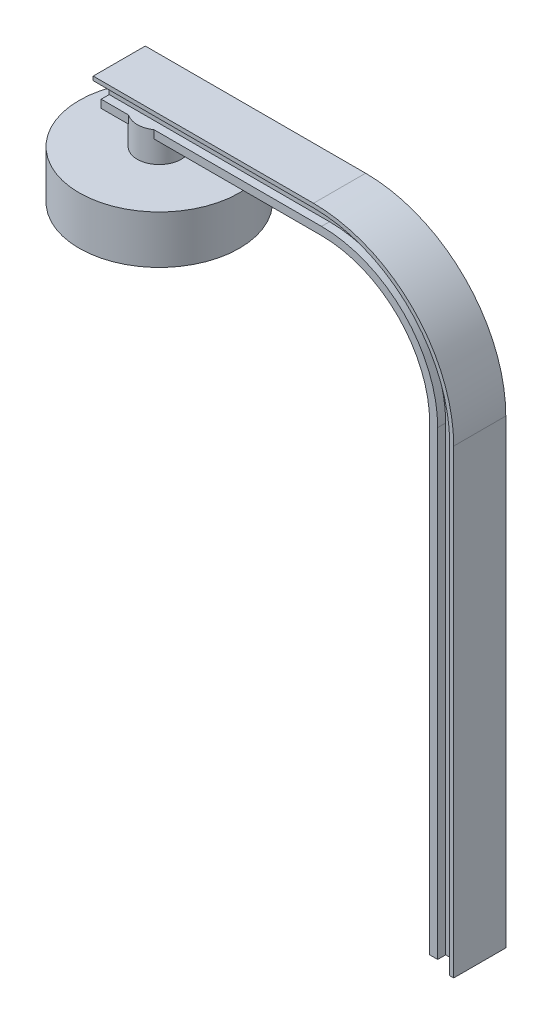
ISO-10303-21;
HEADER;
FILE_DESCRIPTION(('STEP AP214'),'2;1');
FILE_NAME('part.step','',(''),(''),'','','');
FILE_SCHEMA(('AUTOMOTIVE_DESIGN { 1 0 10303 214 1 1 1 1 }'));
ENDSEC;
DATA;
#1=APPLICATION_CONTEXT('core data for automotive mechanical design processes');
#2=APPLICATION_PROTOCOL_DEFINITION('international standard','automotive_design',2000,#1);
#3=PRODUCT_CONTEXT('',#1,'mechanical');
#4=PRODUCT('Part','Part','',(#3));
#5=PRODUCT_RELATED_PRODUCT_CATEGORY('part','',(#4));
#6=PRODUCT_DEFINITION_FORMATION('','',#4);
#7=PRODUCT_DEFINITION_CONTEXT('part definition',#1,'design');
#8=PRODUCT_DEFINITION('design','',#6,#7);
#9=PRODUCT_DEFINITION_SHAPE('','',#8);
#10=(LENGTH_UNIT() NAMED_UNIT(*) SI_UNIT(.MILLI.,.METRE.));
#11=(NAMED_UNIT(*) PLANE_ANGLE_UNIT() SI_UNIT($,.RADIAN.));
#12=(NAMED_UNIT(*) SI_UNIT($,.STERADIAN.) SOLID_ANGLE_UNIT());
#13=UNCERTAINTY_MEASURE_WITH_UNIT(LENGTH_MEASURE(1.E-05),#10,'distance_accuracy_value','');
#14=(GEOMETRIC_REPRESENTATION_CONTEXT(3) GLOBAL_UNCERTAINTY_ASSIGNED_CONTEXT((#13)) GLOBAL_UNIT_ASSIGNED_CONTEXT((#10,
#11,#12)) REPRESENTATION_CONTEXT('',''));
#15=CARTESIAN_POINT('',(0.,0.,0.));
#16=DIRECTION('',(0.,0.,1.));
#17=DIRECTION('',(1.,0.,0.));
#18=AXIS2_PLACEMENT_3D('',#15,#16,#17);
#19=CARTESIAN_POINT('',(-35.,142.,-4.5));
#20=DIRECTION('',(0.,0.913811548620255,0.406138466053453));
#21=DIRECTION('',(0.,-0.406138466053453,0.913811548620255));
#22=AXIS2_PLACEMENT_3D('',#19,#20,#21);
#23=PLANE('',#22);
#24=DIRECTION('',(-1.,0.,0.));
#25=VECTOR('',#24,1.);
#26=CARTESIAN_POINT('',(-35.,142.,-4.5));
#27=LINE('',#26,#25);
#28=CARTESIAN_POINT('',(-83.1622776601684,142.,-4.5));
#29=VERTEX_POINT('',#28);
#30=CARTESIAN_POINT('',(-90.,142.,-4.5));
#31=VERTEX_POINT('',#30);
#32=EDGE_CURVE('E360',#29,#31,#27,.T.);
#33=ORIENTED_EDGE('',*,*,#32,.F.);
#34=CARTESIAN_POINT('',(-80.,140.,0.));
#35=DIRECTION('',(0.,0.913811548620255,0.406138466053453));
#36=DIRECTION('',(0.,0.406138466053453,-0.913811548620255));
#37=AXIS2_PLACEMENT_3D('',#34,#35,#36);
#38=ELLIPSE('',#37,6.01874643443097,5.5);
#39=CARTESIAN_POINT('',(-85.5,140.,0.));
#40=VERTEX_POINT('',#39);
#41=EDGE_CURVE('E541',#29,#40,#38,.T.);
#42=ORIENTED_EDGE('',*,*,#41,.T.);
#43=DIRECTION('',(-1.,0.,0.));
#44=VECTOR('',#43,1.);
#45=CARTESIAN_POINT('',(-35.,140.,0.));
#46=LINE('',#45,#44);
#47=CARTESIAN_POINT('',(-90.,140.,0.));
#48=VERTEX_POINT('',#47);
#49=EDGE_CURVE('E355',#40,#48,#46,.T.);
#50=ORIENTED_EDGE('',*,*,#49,.T.);
#51=DIRECTION('',(0.,0.406138466053453,-0.913811548620255));
#52=VECTOR('',#51,1.);
#53=CARTESIAN_POINT('',(-90.,142.,-4.5));
#54=LINE('',#53,#52);
#55=EDGE_CURVE('E350',#48,#31,#54,.T.);
#56=ORIENTED_EDGE('',*,*,#55,.T.);
#57=EDGE_LOOP('',(#33,#42,#50,#56));
#58=FACE_BOUND('',#57,.T.);
#59=ADVANCED_FACE('F36',(#58),#23,.F.);
#60=CARTESIAN_POINT('',(-35.,144.,-4.5));
#61=DIRECTION('',(0.,0.,1.));
#62=DIRECTION('',(1.,0.,0.));
#63=AXIS2_PLACEMENT_3D('',#60,#61,#62);
#64=PLANE('',#63);
#65=CARTESIAN_POINT('',(-35.,142.,-4.5));
#66=VERTEX_POINT('',#65);
#67=CARTESIAN_POINT('',(-76.8377223398316,142.,-4.5));
#68=VERTEX_POINT('',#67);
#69=EDGE_CURVE('E363',#66,#68,#27,.T.);
#70=ORIENTED_EDGE('',*,*,#69,.T.);
#71=DIRECTION('',(0.,1.,0.));
#72=VECTOR('',#71,1.);
#73=CARTESIAN_POINT('',(-76.8377223398316,136.5,-4.5));
#74=LINE('',#73,#72);
#75=CARTESIAN_POINT('',(-76.8377223398316,144.,-4.5));
#76=VERTEX_POINT('',#75);
#77=EDGE_CURVE('E546',#68,#76,#74,.T.);
#78=ORIENTED_EDGE('',*,*,#77,.T.);
#79=DIRECTION('',(-1.,0.,0.));
#80=VECTOR('',#79,1.);
#81=CARTESIAN_POINT('',(-35.,144.,-4.5));
#82=LINE('',#81,#80);
#83=CARTESIAN_POINT('',(-35.,144.,-4.5));
#84=VERTEX_POINT('',#83);
#85=EDGE_CURVE('E367',#84,#76,#82,.T.);
#86=ORIENTED_EDGE('',*,*,#85,.F.);
#87=CARTESIAN_POINT('',(-35.0000010733833,114.999998926617,-4.5));
#88=DIRECTION('',(0.,0.,-1.));
#89=DIRECTION('',(3.70132158338394E-08,0.999999999999999,0.));
#90=AXIS2_PLACEMENT_3D('',#87,#88,#89);
#91=CIRCLE('',#90,29.0000010733833);
#92=CARTESIAN_POINT('',(-5.99999999999994,114.999998742608,-4.5));
#93=VERTEX_POINT('',#92);
#94=EDGE_CURVE('E331',#84,#93,#91,.T.);
#95=ORIENTED_EDGE('',*,*,#94,.T.);
#96=DIRECTION('',(0.,1.,0.));
#97=VECTOR('',#96,1.);
#98=CARTESIAN_POINT('',(-5.99999999999996,-1.15000017327474,-4.5));
#99=LINE('',#98,#97);
#100=CARTESIAN_POINT('',(-5.99999999999996,0.,-4.5));
#101=VERTEX_POINT('',#100);
#102=EDGE_CURVE('E302',#101,#93,#99,.T.);
#103=ORIENTED_EDGE('',*,*,#102,.F.);
#104=DIRECTION('',(1.,0.,0.));
#105=VECTOR('',#104,1.);
#106=CARTESIAN_POINT('',(-7.99999999999996,0.,-4.5));
#107=LINE('',#106,#105);
#108=CARTESIAN_POINT('',(-7.99999999999996,0.,-4.5));
#109=VERTEX_POINT('',#108);
#110=EDGE_CURVE('E303',#109,#101,#107,.T.);
#111=ORIENTED_EDGE('',*,*,#110,.F.);
#112=DIRECTION('',(0.,1.,0.));
#113=VECTOR('',#112,1.);
#114=CARTESIAN_POINT('',(-7.99999999999996,-1.15000023461093,-4.5));
#115=LINE('',#114,#113);
#116=CARTESIAN_POINT('',(-7.99999999999994,114.999998681272,-4.5));
#117=VERTEX_POINT('',#116);
#118=EDGE_CURVE('E301',#109,#117,#115,.T.);
#119=ORIENTED_EDGE('',*,*,#118,.T.);
#120=CARTESIAN_POINT('',(-35.0000010733833,114.999998926617,-4.5));
#121=DIRECTION('',(0.,0.,-1.));
#122=DIRECTION('',(3.97549354162381E-08,0.999999999999999,0.));
#123=AXIS2_PLACEMENT_3D('',#120,#121,#122);
#124=CIRCLE('',#123,27.0000010733833);
#125=EDGE_CURVE('E328',#66,#117,#124,.T.);
#126=ORIENTED_EDGE('',*,*,#125,.F.);
#127=EDGE_LOOP('',(#70,#78,#86,#95,#103,#111,#119,#126));
#128=FACE_BOUND('',#127,.T.);
#129=ADVANCED_FACE('F565',(#128),#64,.F.);
#130=CARTESIAN_POINT('',(-35.,144.,4.5));
#131=DIRECTION('',(0.,0.,-1.));
#132=DIRECTION('',(-1.,0.,0.));
#133=AXIS2_PLACEMENT_3D('',#130,#131,#132);
#134=PLANE('',#133);
#135=DIRECTION('',(-1.,0.,0.));
#136=VECTOR('',#135,1.);
#137=CARTESIAN_POINT('',(-35.,142.,4.5));
#138=LINE('',#137,#136);
#139=CARTESIAN_POINT('',(-83.1622776601684,142.,4.5));
#140=VERTEX_POINT('',#139);
#141=CARTESIAN_POINT('',(-90.,142.,4.5));
#142=VERTEX_POINT('',#141);
#143=EDGE_CURVE('E265',#140,#142,#138,.T.);
#144=ORIENTED_EDGE('',*,*,#143,.F.);
#145=DIRECTION('',(0.,1.,0.));
#146=VECTOR('',#145,1.);
#147=CARTESIAN_POINT('',(-83.1622776601684,136.5,4.5));
#148=LINE('',#147,#146);
#149=CARTESIAN_POINT('',(-83.1622776601684,144.,4.5));
#150=VERTEX_POINT('',#149);
#151=EDGE_CURVE('E51',#140,#150,#148,.T.);
#152=ORIENTED_EDGE('',*,*,#151,.T.);
#153=DIRECTION('',(-1.,0.,0.));
#154=VECTOR('',#153,1.);
#155=CARTESIAN_POINT('',(-35.,144.,4.5));
#156=LINE('',#155,#154);
#157=CARTESIAN_POINT('',(-90.,144.,4.5));
#158=VERTEX_POINT('',#157);
#159=EDGE_CURVE('E257',#150,#158,#156,.T.);
#160=ORIENTED_EDGE('',*,*,#159,.T.);
#161=DIRECTION('',(0.,-1.,0.));
#162=VECTOR('',#161,1.);
#163=CARTESIAN_POINT('',(-90.,144.,4.5));
#164=LINE('',#163,#162);
#165=EDGE_CURVE('E423',#158,#142,#164,.T.);
#166=ORIENTED_EDGE('',*,*,#165,.T.);
#167=EDGE_LOOP('',(#144,#152,#160,#166));
#168=FACE_BOUND('',#167,.T.);
#169=ADVANCED_FACE('F421',(#168),#134,.F.);
#170=CARTESIAN_POINT('',(-35.,142.,4.5));
#171=DIRECTION('',(0.,0.913811548620255,-0.406138466053453));
#172=DIRECTION('',(0.,0.406138466053453,0.913811548620255));
#173=AXIS2_PLACEMENT_3D('',#170,#171,#172);
#174=PLANE('',#173);
#175=CARTESIAN_POINT('',(-35.,142.,4.5));
#176=VERTEX_POINT('',#175);
#177=CARTESIAN_POINT('',(-76.8377223398316,142.,4.5));
#178=VERTEX_POINT('',#177);
#179=EDGE_CURVE('E267',#176,#178,#138,.T.);
#180=ORIENTED_EDGE('',*,*,#179,.T.);
#181=CARTESIAN_POINT('',(-80.,140.,0.));
#182=DIRECTION('',(0.,0.913811548620255,-0.406138466053453));
#183=DIRECTION('',(0.,0.406138466053453,0.913811548620255));
#184=AXIS2_PLACEMENT_3D('',#181,#182,#183);
#185=ELLIPSE('',#184,6.01874643443097,5.5);
#186=CARTESIAN_POINT('',(-74.5,140.,0.));
#187=VERTEX_POINT('',#186);
#188=EDGE_CURVE('E11',#178,#187,#185,.T.);
#189=ORIENTED_EDGE('',*,*,#188,.T.);
#190=CARTESIAN_POINT('',(-35.,140.,0.));
#191=VERTEX_POINT('',#190);
#192=EDGE_CURVE('E357',#191,#187,#46,.T.);
#193=ORIENTED_EDGE('',*,*,#192,.F.);
#194=DIRECTION('',(0.,0.406138466053453,0.913811548620255));
#195=VECTOR('',#194,1.);
#196=CARTESIAN_POINT('',(-35.,142.,4.5));
#197=LINE('',#196,#195);
#198=EDGE_CURVE('E275',#176,#191,#197,.F.);
#199=ORIENTED_EDGE('',*,*,#198,.F.);
#200=EDGE_LOOP('',(#180,#189,#193,#199));
#201=FACE_BOUND('',#200,.T.);
#202=ADVANCED_FACE('F653',(#201),#174,.F.);
#203=CARTESIAN_POINT('',(-35.0000010733833,114.999998926617,6.5));
#204=DIRECTION('',(0.,0.,-1.));
#205=DIRECTION('',(-1.,0.,0.));
#206=AXIS2_PLACEMENT_3D('',#203,#204,#205);
#207=PLANE('',#206);
#208=CARTESIAN_POINT('',(-35.0000010733833,114.999998926617,6.5));
#209=DIRECTION('',(0.,0.,-1.));
#210=DIRECTION('',(3.15700960301147E-08,1.,0.));
#211=AXIS2_PLACEMENT_3D('',#208,#209,#210);
#212=CIRCLE('',#211,34.0000010733833);
#213=CARTESIAN_POINT('',(-35.,149.,6.5));
#214=VERTEX_POINT('',#213);
#215=CARTESIAN_POINT('',(-0.999999999999966,114.999998895949,6.5));
#216=VERTEX_POINT('',#215);
#217=EDGE_CURVE('E497',#214,#216,#212,.T.);
#218=ORIENTED_EDGE('',*,*,#217,.T.);
#219=DIRECTION('',(0.,1.,0.));
#220=VECTOR('',#219,1.);
#221=CARTESIAN_POINT('',(-0.99999999999998,-1.15000001993427,6.5));
#222=LINE('',#221,#220);
#223=CARTESIAN_POINT('',(-0.99999999999998,0.,6.5));
#224=VERTEX_POINT('',#223);
#225=EDGE_CURVE('E491',#224,#216,#222,.T.);
#226=ORIENTED_EDGE('',*,*,#225,.F.);
#227=DIRECTION('',(-1.,0.,0.));
#228=VECTOR('',#227,1.);
#229=CARTESIAN_POINT('',(0.,0.,6.5));
#230=LINE('',#229,#228);
#231=CARTESIAN_POINT('',(0.,0.,6.5));
#232=VERTEX_POINT('',#231);
#233=EDGE_CURVE('E388',#232,#224,#230,.T.);
#234=ORIENTED_EDGE('',*,*,#233,.F.);
#235=DIRECTION('',(0.,1.,0.));
#236=VECTOR('',#235,1.);
#237=CARTESIAN_POINT('',(0.,0.,6.5));
#238=LINE('',#237,#236);
#239=CARTESIAN_POINT('',(0.,114.999998926617,6.5));
#240=VERTEX_POINT('',#239);
#241=EDGE_CURVE('E377',#232,#240,#238,.T.);
#242=ORIENTED_EDGE('',*,*,#241,.T.);
#243=CARTESIAN_POINT('',(-35.0000010733833,114.999998926617,6.5));
#244=DIRECTION('',(0.,0.,-1.));
#245=DIRECTION('',(-1.,0.,0.));
#246=AXIS2_PLACEMENT_3D('',#243,#244,#245);
#247=CIRCLE('',#246,35.0000010733833);
#248=CARTESIAN_POINT('',(-35.,150.,6.5));
#249=VERTEX_POINT('',#248);
#250=EDGE_CURVE('E379',#249,#240,#247,.T.);
#251=ORIENTED_EDGE('',*,*,#250,.F.);
#252=DIRECTION('',(-1.,0.,0.));
#253=VECTOR('',#252,1.);
#254=CARTESIAN_POINT('',(-35.,150.,6.5));
#255=LINE('',#254,#253);
#256=CARTESIAN_POINT('',(-90.,150.,6.5));
#257=VERTEX_POINT('',#256);
#258=EDGE_CURVE('E383',#249,#257,#255,.T.);
#259=ORIENTED_EDGE('',*,*,#258,.T.);
#260=DIRECTION('',(0.,-1.,0.));
#261=VECTOR('',#260,1.);
#262=CARTESIAN_POINT('',(-90.,150.,6.5));
#263=LINE('',#262,#261);
#264=CARTESIAN_POINT('',(-90.,149.,6.5));
#265=VERTEX_POINT('',#264);
#266=EDGE_CURVE('E385',#257,#265,#263,.T.);
#267=ORIENTED_EDGE('',*,*,#266,.T.);
#268=DIRECTION('',(-1.,0.,0.));
#269=VECTOR('',#268,1.);
#270=CARTESIAN_POINT('',(-35.,149.,6.5));
#271=LINE('',#270,#269);
#272=EDGE_CURVE('E274',#214,#265,#271,.T.);
#273=ORIENTED_EDGE('',*,*,#272,.F.);
#274=EDGE_LOOP('',(#218,#226,#234,#242,#251,#259,#267,#273));
#275=FACE_BOUND('',#274,.T.);
#276=ADVANCED_FACE('F510',(#275),#207,.F.);
#277=CARTESIAN_POINT('',(-35.0000010733833,114.999998926617,-6.5));
#278=DIRECTION('',(0.,0.,-1.));
#279=DIRECTION('',(-1.,0.,0.));
#280=AXIS2_PLACEMENT_3D('',#277,#278,#279);
#281=PLANE('',#280);
#282=DIRECTION('',(0.,1.,0.));
#283=VECTOR('',#282,1.);
#284=CARTESIAN_POINT('',(-0.99999999999998,-1.15000001993427,-6.5));
#285=LINE('',#284,#283);
#286=CARTESIAN_POINT('',(-0.999999999999966,0.,-6.5));
#287=VERTEX_POINT('',#286);
#288=CARTESIAN_POINT('',(-0.999999999999966,114.999998895949,-6.5));
#289=VERTEX_POINT('',#288);
#290=EDGE_CURVE('E293',#287,#289,#285,.T.);
#291=ORIENTED_EDGE('',*,*,#290,.T.);
#292=CARTESIAN_POINT('',(-35.0000010733833,114.999998926617,-6.5));
#293=DIRECTION('',(0.,0.,-1.));
#294=DIRECTION('',(3.15700960301147E-08,1.,0.));
#295=AXIS2_PLACEMENT_3D('',#292,#293,#294);
#296=CIRCLE('',#295,34.0000010733833);
#297=CARTESIAN_POINT('',(-35.,149.,-6.5));
#298=VERTEX_POINT('',#297);
#299=EDGE_CURVE('E317',#298,#289,#296,.T.);
#300=ORIENTED_EDGE('',*,*,#299,.F.);
#301=DIRECTION('',(-1.,0.,0.));
#302=VECTOR('',#301,1.);
#303=CARTESIAN_POINT('',(-35.,149.,-6.5));
#304=LINE('',#303,#302);
#305=CARTESIAN_POINT('',(-90.,149.,-6.5));
#306=VERTEX_POINT('',#305);
#307=EDGE_CURVE('E353',#298,#306,#304,.T.);
#308=ORIENTED_EDGE('',*,*,#307,.T.);
#309=DIRECTION('',(0.,-1.,0.));
#310=VECTOR('',#309,1.);
#311=CARTESIAN_POINT('',(-90.,150.,-6.5));
#312=LINE('',#311,#310);
#313=CARTESIAN_POINT('',(-90.,150.,-6.5));
#314=VERTEX_POINT('',#313);
#315=EDGE_CURVE('E399',#314,#306,#312,.T.);
#316=ORIENTED_EDGE('',*,*,#315,.F.);
#317=DIRECTION('',(-1.,0.,0.));
#318=VECTOR('',#317,1.);
#319=CARTESIAN_POINT('',(-35.,150.,-6.5));
#320=LINE('',#319,#318);
#321=CARTESIAN_POINT('',(-35.,150.,-6.5));
#322=VERTEX_POINT('',#321);
#323=EDGE_CURVE('E397',#322,#314,#320,.T.);
#324=ORIENTED_EDGE('',*,*,#323,.F.);
#325=CARTESIAN_POINT('',(-35.0000010733833,114.999998926617,-6.5));
#326=DIRECTION('',(0.,0.,-1.));
#327=DIRECTION('',(-1.,0.,0.));
#328=AXIS2_PLACEMENT_3D('',#325,#326,#327);
#329=CIRCLE('',#328,35.0000010733833);
#330=CARTESIAN_POINT('',(0.,114.999998926617,-6.5));
#331=VERTEX_POINT('',#330);
#332=EDGE_CURVE('E394',#322,#331,#329,.T.);
#333=ORIENTED_EDGE('',*,*,#332,.T.);
#334=DIRECTION('',(0.,1.,0.));
#335=VECTOR('',#334,1.);
#336=CARTESIAN_POINT('',(0.,0.,-6.5));
#337=LINE('',#336,#335);
#338=CARTESIAN_POINT('',(0.,0.,-6.5));
#339=VERTEX_POINT('',#338);
#340=EDGE_CURVE('E376',#339,#331,#337,.T.);
#341=ORIENTED_EDGE('',*,*,#340,.F.);
#342=DIRECTION('',(-1.,0.,0.));
#343=VECTOR('',#342,1.);
#344=CARTESIAN_POINT('',(0.,0.,-6.5));
#345=LINE('',#344,#343);
#346=EDGE_CURVE('E380',#339,#287,#345,.T.);
#347=ORIENTED_EDGE('',*,*,#346,.T.);
#348=EDGE_LOOP('',(#291,#300,#308,#316,#324,#333,#341,#347));
#349=FACE_BOUND('',#348,.T.);
#350=ADVANCED_FACE('F518',(#349),#281,.T.);
#351=CARTESIAN_POINT('',(0.,0.,6.5));
#352=DIRECTION('',(-1.,0.,0.));
#353=DIRECTION('',(0.,-1.,0.));
#354=AXIS2_PLACEMENT_3D('',#351,#352,#353);
#355=PLANE('',#354);
#356=ORIENTED_EDGE('',*,*,#340,.T.);
#357=DIRECTION('',(0.,0.,-1.));
#358=VECTOR('',#357,1.);
#359=CARTESIAN_POINT('',(0.,114.999998926617,6.5));
#360=LINE('',#359,#358);
#361=EDGE_CURVE('E409',#240,#331,#360,.T.);
#362=ORIENTED_EDGE('',*,*,#361,.F.);
#363=ORIENTED_EDGE('',*,*,#241,.F.);
#364=DIRECTION('',(0.,0.,-1.));
#365=VECTOR('',#364,1.);
#366=CARTESIAN_POINT('',(0.,0.,6.5));
#367=LINE('',#366,#365);
#368=EDGE_CURVE('E391',#232,#339,#367,.T.);
#369=ORIENTED_EDGE('',*,*,#368,.T.);
#370=EDGE_LOOP('',(#356,#362,#363,#369));
#371=FACE_BOUND('',#370,.T.);
#372=ADVANCED_FACE('F38',(#371),#355,.F.);
#373=CARTESIAN_POINT('',(-35.0000010733833,114.999998926617,6.5));
#374=DIRECTION('',(0.,0.,-1.));
#375=DIRECTION('',(-1.,0.,0.));
#376=AXIS2_PLACEMENT_3D('',#373,#374,#375);
#377=CYLINDRICAL_SURFACE('',#376,35.0000010733833);
#378=ORIENTED_EDGE('',*,*,#332,.F.);
#379=DIRECTION('',(0.,0.,-1.));
#380=VECTOR('',#379,1.);
#381=CARTESIAN_POINT('',(-35.,150.,6.5));
#382=LINE('',#381,#380);
#383=EDGE_CURVE('E408',#249,#322,#382,.T.);
#384=ORIENTED_EDGE('',*,*,#383,.F.);
#385=ORIENTED_EDGE('',*,*,#250,.T.);
#386=ORIENTED_EDGE('',*,*,#361,.T.);
#387=EDGE_LOOP('',(#378,#384,#385,#386));
#388=FACE_BOUND('',#387,.T.);
#389=ADVANCED_FACE('F924',(#388),#377,.T.);
#390=CARTESIAN_POINT('',(-35.,150.,6.5));
#391=DIRECTION('',(0.,-1.,0.));
#392=DIRECTION('',(0.,0.,-1.));
#393=AXIS2_PLACEMENT_3D('',#390,#391,#392);
#394=PLANE('',#393);
#395=ORIENTED_EDGE('',*,*,#323,.T.);
#396=DIRECTION('',(0.,0.,-1.));
#397=VECTOR('',#396,1.);
#398=CARTESIAN_POINT('',(-90.,150.,6.5));
#399=LINE('',#398,#397);
#400=EDGE_CURVE('E405',#257,#314,#399,.T.);
#401=ORIENTED_EDGE('',*,*,#400,.F.);
#402=ORIENTED_EDGE('',*,*,#258,.F.);
#403=ORIENTED_EDGE('',*,*,#383,.T.);
#404=EDGE_LOOP('',(#395,#401,#402,#403));
#405=FACE_BOUND('',#404,.T.);
#406=ADVANCED_FACE('F845',(#405),#394,.F.);
#407=CARTESIAN_POINT('',(-90.,150.,6.5));
#408=DIRECTION('',(1.,0.,0.));
#409=DIRECTION('',(0.,0.,-1.));
#410=AXIS2_PLACEMENT_3D('',#407,#408,#409);
#411=PLANE('',#410);
#412=ORIENTED_EDGE('',*,*,#55,.F.);
#413=DIRECTION('',(0.,-0.406138466053453,-0.913811548620255));
#414=VECTOR('',#413,1.);
#415=CARTESIAN_POINT('',(-90.,142.,4.5));
#416=LINE('',#415,#414);
#417=EDGE_CURVE('E279',#142,#48,#416,.T.);
#418=ORIENTED_EDGE('',*,*,#417,.F.);
#419=ORIENTED_EDGE('',*,*,#165,.F.);
#420=DIRECTION('',(0.,0.,1.));
#421=VECTOR('',#420,1.);
#422=CARTESIAN_POINT('',(-90.,144.,2.5));
#423=LINE('',#422,#421);
#424=CARTESIAN_POINT('',(-90.,144.,2.5));
#425=VERTEX_POINT('',#424);
#426=EDGE_CURVE('E427',#425,#158,#423,.T.);
#427=ORIENTED_EDGE('',*,*,#426,.F.);
#428=DIRECTION('',(0.,-1.,0.));
#429=VECTOR('',#428,1.);
#430=CARTESIAN_POINT('',(-90.,149.,2.5));
#431=LINE('',#430,#429);
#432=CARTESIAN_POINT('',(-90.,149.,2.5));
#433=VERTEX_POINT('',#432);
#434=EDGE_CURVE('E285',#433,#425,#431,.T.);
#435=ORIENTED_EDGE('',*,*,#434,.F.);
#436=DIRECTION('',(0.,0.,-1.));
#437=VECTOR('',#436,1.);
#438=CARTESIAN_POINT('',(-90.,149.,6.5));
#439=LINE('',#438,#437);
#440=EDGE_CURVE('E282',#265,#433,#439,.T.);
#441=ORIENTED_EDGE('',*,*,#440,.F.);
#442=ORIENTED_EDGE('',*,*,#266,.F.);
#443=ORIENTED_EDGE('',*,*,#400,.T.);
#444=ORIENTED_EDGE('',*,*,#315,.T.);
#445=DIRECTION('',(0.,0.,-1.));
#446=VECTOR('',#445,1.);
#447=CARTESIAN_POINT('',(-90.,149.,-6.5));
#448=LINE('',#447,#446);
#449=CARTESIAN_POINT('',(-90.,149.,-2.5));
#450=VERTEX_POINT('',#449);
#451=EDGE_CURVE('E59',#450,#306,#448,.T.);
#452=ORIENTED_EDGE('',*,*,#451,.F.);
#453=DIRECTION('',(0.,1.,0.));
#454=VECTOR('',#453,1.);
#455=CARTESIAN_POINT('',(-90.,149.,-2.5));
#456=LINE('',#455,#454);
#457=CARTESIAN_POINT('',(-90.,144.,-2.5));
#458=VERTEX_POINT('',#457);
#459=EDGE_CURVE('E341',#458,#450,#456,.T.);
#460=ORIENTED_EDGE('',*,*,#459,.F.);
#461=DIRECTION('',(0.,0.,1.));
#462=VECTOR('',#461,1.);
#463=CARTESIAN_POINT('',(-90.,144.,-2.5));
#464=LINE('',#463,#462);
#465=CARTESIAN_POINT('',(-90.,144.,-4.5));
#466=VERTEX_POINT('',#465);
#467=EDGE_CURVE('E343',#466,#458,#464,.T.);
#468=ORIENTED_EDGE('',*,*,#467,.F.);
#469=DIRECTION('',(0.,1.,0.));
#470=VECTOR('',#469,1.);
#471=CARTESIAN_POINT('',(-90.,144.,-4.5));
#472=LINE('',#471,#470);
#473=EDGE_CURVE('E347',#31,#466,#472,.T.);
#474=ORIENTED_EDGE('',*,*,#473,.F.);
#475=EDGE_LOOP('',(#412,#418,#419,#427,#435,#441,#442,#443,#444,#452,#460,#468,#474));
#476=FACE_BOUND('',#475,.T.);
#477=ADVANCED_FACE('F430',(#476),#411,.F.);
#478=CARTESIAN_POINT('',(0.,0.,6.5));
#479=DIRECTION('',(0.,-1.,0.));
#480=DIRECTION('',(0.,0.,-1.));
#481=AXIS2_PLACEMENT_3D('',#478,#479,#480);
#482=PLANE('',#481);
#483=DIRECTION('',(0.,0.,-1.));
#484=VECTOR('',#483,1.);
#485=CARTESIAN_POINT('',(-0.99999999999998,0.,6.5));
#486=LINE('',#485,#484);
#487=CARTESIAN_POINT('',(-0.999999999999938,0.,2.5));
#488=VERTEX_POINT('',#487);
#489=EDGE_CURVE('E480',#224,#488,#486,.T.);
#490=ORIENTED_EDGE('',*,*,#489,.T.);
#491=DIRECTION('',(-1.,0.,0.));
#492=VECTOR('',#491,1.);
#493=CARTESIAN_POINT('',(-0.999999999999952,0.,2.5));
#494=LINE('',#493,#492);
#495=CARTESIAN_POINT('',(-5.99999999999996,0.,2.5));
#496=VERTEX_POINT('',#495);
#497=EDGE_CURVE('E481',#488,#496,#494,.T.);
#498=ORIENTED_EDGE('',*,*,#497,.T.);
#499=DIRECTION('',(0.,0.,1.));
#500=VECTOR('',#499,1.);
#501=CARTESIAN_POINT('',(-5.99999999999996,0.,2.5));
#502=LINE('',#501,#500);
#503=CARTESIAN_POINT('',(-5.99999999999994,0.,4.5));
#504=VERTEX_POINT('',#503);
#505=EDGE_CURVE('E479',#496,#504,#502,.T.);
#506=ORIENTED_EDGE('',*,*,#505,.T.);
#507=DIRECTION('',(-1.,0.,0.));
#508=VECTOR('',#507,1.);
#509=CARTESIAN_POINT('',(-5.99999999999996,0.,4.5));
#510=LINE('',#509,#508);
#511=CARTESIAN_POINT('',(-7.99999999999996,0.,4.5));
#512=VERTEX_POINT('',#511);
#513=EDGE_CURVE('E496',#504,#512,#510,.T.);
#514=ORIENTED_EDGE('',*,*,#513,.T.);
#515=DIRECTION('',(-0.406138466053452,0.,-0.913811548620255));
#516=VECTOR('',#515,1.);
#517=CARTESIAN_POINT('',(-7.99999999999996,0.,4.5));
#518=LINE('',#517,#516);
#519=CARTESIAN_POINT('',(-9.99999999999998,0.,0.));
#520=VERTEX_POINT('',#519);
#521=EDGE_CURVE('E493',#512,#520,#518,.T.);
#522=ORIENTED_EDGE('',*,*,#521,.T.);
#523=DIRECTION('',(0.406138466053452,0.,-0.913811548620255));
#524=VECTOR('',#523,1.);
#525=CARTESIAN_POINT('',(-9.99999999999998,0.,0.));
#526=LINE('',#525,#524);
#527=EDGE_CURVE('E298',#520,#109,#526,.T.);
#528=ORIENTED_EDGE('',*,*,#527,.T.);
#529=ORIENTED_EDGE('',*,*,#110,.T.);
#530=DIRECTION('',(0.,0.,1.));
#531=VECTOR('',#530,1.);
#532=CARTESIAN_POINT('',(-5.99999999999996,0.,-4.5));
#533=LINE('',#532,#531);
#534=CARTESIAN_POINT('',(-5.99999999999996,0.,-2.5));
#535=VERTEX_POINT('',#534);
#536=EDGE_CURVE('E284',#101,#535,#533,.T.);
#537=ORIENTED_EDGE('',*,*,#536,.T.);
#538=DIRECTION('',(1.,0.,0.));
#539=VECTOR('',#538,1.);
#540=CARTESIAN_POINT('',(-5.99999999999996,0.,-2.5));
#541=LINE('',#540,#539);
#542=CARTESIAN_POINT('',(-0.999999999999952,0.,-2.5));
#543=VERTEX_POINT('',#542);
#544=EDGE_CURVE('E289',#535,#543,#541,.T.);
#545=ORIENTED_EDGE('',*,*,#544,.T.);
#546=DIRECTION('',(0.,0.,-1.));
#547=VECTOR('',#546,1.);
#548=CARTESIAN_POINT('',(-0.999999999999952,0.,-2.5));
#549=LINE('',#548,#547);
#550=EDGE_CURVE('E294',#543,#287,#549,.T.);
#551=ORIENTED_EDGE('',*,*,#550,.T.);
#552=ORIENTED_EDGE('',*,*,#346,.F.);
#553=ORIENTED_EDGE('',*,*,#368,.F.);
#554=ORIENTED_EDGE('',*,*,#233,.T.);
#555=EDGE_LOOP('',(#490,#498,#506,#514,#522,#528,#529,#537,#545,#551,#552,#553,#554));
#556=FACE_BOUND('',#555,.T.);
#557=ADVANCED_FACE('F558',(#556),#482,.T.);
#558=ORIENTED_EDGE('',*,*,#192,.T.);
#559=EDGE_CURVE('E247',#187,#68,#38,.T.);
#560=ORIENTED_EDGE('',*,*,#559,.T.);
#561=ORIENTED_EDGE('',*,*,#69,.F.);
#562=DIRECTION('',(0.,0.406138466053453,-0.913811548620255));
#563=VECTOR('',#562,1.);
#564=CARTESIAN_POINT('',(-35.,142.,-4.5));
#565=LINE('',#564,#563);
#566=EDGE_CURVE('E340',#191,#66,#565,.T.);
#567=ORIENTED_EDGE('',*,*,#566,.F.);
#568=EDGE_LOOP('',(#558,#560,#561,#567));
#569=FACE_BOUND('',#568,.T.);
#570=ADVANCED_FACE('F590',(#569),#23,.F.);
#571=CARTESIAN_POINT('',(-83.1622776601684,144.,-4.5));
#572=VERTEX_POINT('',#571);
#573=EDGE_CURVE('E366',#572,#466,#82,.T.);
#574=ORIENTED_EDGE('',*,*,#573,.F.);
#575=DIRECTION('',(0.,1.,0.));
#576=VECTOR('',#575,1.);
#577=CARTESIAN_POINT('',(-83.1622776601684,136.5,-4.5));
#578=LINE('',#577,#576);
#579=EDGE_CURVE('E248',#572,#29,#578,.F.);
#580=ORIENTED_EDGE('',*,*,#579,.T.);
#581=ORIENTED_EDGE('',*,*,#32,.T.);
#582=ORIENTED_EDGE('',*,*,#473,.T.);
#583=EDGE_LOOP('',(#574,#580,#581,#582));
#584=FACE_BOUND('',#583,.T.);
#585=ADVANCED_FACE('F538',(#584),#64,.F.);
#586=CARTESIAN_POINT('',(-35.,144.,-2.5));
#587=DIRECTION('',(0.,-1.,0.));
#588=DIRECTION('',(0.,0.,-1.));
#589=AXIS2_PLACEMENT_3D('',#586,#587,#588);
#590=PLANE('',#589);
#591=ORIENTED_EDGE('',*,*,#467,.T.);
#592=DIRECTION('',(-1.,0.,0.));
#593=VECTOR('',#592,1.);
#594=CARTESIAN_POINT('',(-35.,144.,-2.5));
#595=LINE('',#594,#593);
#596=CARTESIAN_POINT('',(-35.,144.,-2.5));
#597=VERTEX_POINT('',#596);
#598=EDGE_CURVE('E370',#597,#458,#595,.T.);
#599=ORIENTED_EDGE('',*,*,#598,.F.);
#600=DIRECTION('',(0.,0.,1.));
#601=VECTOR('',#600,1.);
#602=CARTESIAN_POINT('',(-35.,144.,-2.5));
#603=LINE('',#602,#601);
#604=EDGE_CURVE('E362',#84,#597,#603,.T.);
#605=ORIENTED_EDGE('',*,*,#604,.F.);
#606=ORIENTED_EDGE('',*,*,#85,.T.);
#607=CARTESIAN_POINT('',(-80.,144.,0.));
#608=DIRECTION('',(0.,1.,0.));
#609=DIRECTION('',(0.,0.,1.));
#610=AXIS2_PLACEMENT_3D('',#607,#608,#609);
#611=CIRCLE('',#610,5.5);
#612=EDGE_CURVE('E258',#76,#572,#611,.T.);
#613=ORIENTED_EDGE('',*,*,#612,.T.);
#614=ORIENTED_EDGE('',*,*,#573,.T.);
#615=EDGE_LOOP('',(#591,#599,#605,#606,#613,#614));
#616=FACE_BOUND('',#615,.T.);
#617=ADVANCED_FACE('F532',(#616),#590,.F.);
#618=CARTESIAN_POINT('',(-35.,149.,-2.5));
#619=DIRECTION('',(0.,0.,1.));
#620=DIRECTION('',(1.,0.,0.));
#621=AXIS2_PLACEMENT_3D('',#618,#619,#620);
#622=PLANE('',#621);
#623=ORIENTED_EDGE('',*,*,#459,.T.);
#624=DIRECTION('',(-1.,0.,0.));
#625=VECTOR('',#624,1.);
#626=CARTESIAN_POINT('',(-35.,149.,-2.5));
#627=LINE('',#626,#625);
#628=CARTESIAN_POINT('',(-35.,149.,-2.5));
#629=VERTEX_POINT('',#628);
#630=EDGE_CURVE('E344',#629,#450,#627,.T.);
#631=ORIENTED_EDGE('',*,*,#630,.F.);
#632=CARTESIAN_POINT('',(-35.0000010733833,114.999998926617,-2.5));
#633=DIRECTION('',(0.,0.,-1.));
#634=DIRECTION('',(3.15700960301146E-08,1.,0.));
#635=AXIS2_PLACEMENT_3D('',#632,#633,#634);
#636=CIRCLE('',#635,34.0000010733833);
#637=CARTESIAN_POINT('',(-0.999999999999938,114.999998895949,-2.5));
#638=VERTEX_POINT('',#637);
#639=EDGE_CURVE('E313',#629,#638,#636,.T.);
#640=ORIENTED_EDGE('',*,*,#639,.T.);
#641=DIRECTION('',(0.,1.,0.));
#642=VECTOR('',#641,1.);
#643=CARTESIAN_POINT('',(-0.999999999999952,-1.15000001993427,-2.5));
#644=LINE('',#643,#642);
#645=EDGE_CURVE('E292',#543,#638,#644,.T.);
#646=ORIENTED_EDGE('',*,*,#645,.F.);
#647=ORIENTED_EDGE('',*,*,#544,.F.);
#648=DIRECTION('',(0.,1.,0.));
#649=VECTOR('',#648,1.);
#650=CARTESIAN_POINT('',(-5.99999999999996,-1.15000017327474,-2.5));
#651=LINE('',#650,#649);
#652=CARTESIAN_POINT('',(-5.99999999999994,114.999998742608,-2.5));
#653=VERTEX_POINT('',#652);
#654=EDGE_CURVE('E288',#535,#653,#651,.T.);
#655=ORIENTED_EDGE('',*,*,#654,.T.);
#656=CARTESIAN_POINT('',(-35.0000010733833,114.999998926617,-2.5));
#657=DIRECTION('',(0.,0.,-1.));
#658=DIRECTION('',(3.70132158338394E-08,0.999999999999999,0.));
#659=AXIS2_PLACEMENT_3D('',#656,#657,#658);
#660=CIRCLE('',#659,29.0000010733833);
#661=EDGE_CURVE('E337',#597,#653,#660,.T.);
#662=ORIENTED_EDGE('',*,*,#661,.F.);
#663=ORIENTED_EDGE('',*,*,#598,.T.);
#664=EDGE_LOOP('',(#623,#631,#640,#646,#647,#655,#662,#663));
#665=FACE_BOUND('',#664,.T.);
#666=ADVANCED_FACE('F525',(#665),#622,.F.);
#667=CARTESIAN_POINT('',(-35.,149.,-6.5));
#668=DIRECTION('',(0.,1.,0.));
#669=DIRECTION('',(0.,0.,1.));
#670=AXIS2_PLACEMENT_3D('',#667,#668,#669);
#671=PLANE('',#670);
#672=ORIENTED_EDGE('',*,*,#451,.T.);
#673=ORIENTED_EDGE('',*,*,#307,.F.);
#674=DIRECTION('',(0.,0.,-1.));
#675=VECTOR('',#674,1.);
#676=CARTESIAN_POINT('',(-35.,149.,-6.5));
#677=LINE('',#676,#675);
#678=EDGE_CURVE('E356',#629,#298,#677,.T.);
#679=ORIENTED_EDGE('',*,*,#678,.F.);
#680=ORIENTED_EDGE('',*,*,#630,.T.);
#681=EDGE_LOOP('',(#672,#673,#679,#680));
#682=FACE_BOUND('',#681,.T.);
#683=ADVANCED_FACE('F521',(#682),#671,.F.);
#684=CARTESIAN_POINT('',(-35.0000010733833,114.999998926617,-6.5));
#685=DIRECTION('',(0.,0.,-1.));
#686=DIRECTION('',(-1.,0.,0.));
#687=AXIS2_PLACEMENT_3D('',#684,#685,#686);
#688=CYLINDRICAL_SURFACE('',#687,34.0000010733833);
#689=ORIENTED_EDGE('',*,*,#299,.T.);
#690=DIRECTION('',(0.,0.,-1.));
#691=VECTOR('',#690,1.);
#692=CARTESIAN_POINT('',(-0.999999999999945,114.999998895949,-2.5));
#693=LINE('',#692,#691);
#694=EDGE_CURVE('E315',#638,#289,#693,.T.);
#695=ORIENTED_EDGE('',*,*,#694,.F.);
#696=ORIENTED_EDGE('',*,*,#639,.F.);
#697=ORIENTED_EDGE('',*,*,#678,.T.);
#698=EDGE_LOOP('',(#689,#695,#696,#697));
#699=FACE_BOUND('',#698,.T.);
#700=ADVANCED_FACE('F574',(#699),#688,.F.);
#701=CARTESIAN_POINT('',(-35.0000010733833,114.999998926617,0.));
#702=DIRECTION('',(0.,0.,-1.));
#703=DIRECTION('',(-1.,0.,0.));
#704=AXIS2_PLACEMENT_3D('',#701,#702,#703);
#705=CONICAL_SURFACE('',#704,25.0000010733833,0.418224329579234);
#706=ORIENTED_EDGE('',*,*,#125,.T.);
#707=DIRECTION('',(0.406138466053452,1.24554922143192E-08,-0.913811548620255));
#708=VECTOR('',#707,1.);
#709=CARTESIAN_POINT('',(-9.99999999999998,114.999998619936,0.));
#710=LINE('',#709,#708);
#711=CARTESIAN_POINT('',(-9.99999999999997,114.999998619936,0.));
#712=VERTEX_POINT('',#711);
#713=EDGE_CURVE('E325',#712,#117,#710,.T.);
#714=ORIENTED_EDGE('',*,*,#713,.F.);
#715=CARTESIAN_POINT('',(-35.0000010733833,114.999998926617,0.));
#716=DIRECTION('',(0.,0.,-1.));
#717=DIRECTION('',(4.29353301129858E-08,0.999999999999999,0.));
#718=AXIS2_PLACEMENT_3D('',#715,#716,#717);
#719=CIRCLE('',#718,25.0000010733833);
#720=EDGE_CURVE('E320',#191,#712,#719,.T.);
#721=ORIENTED_EDGE('',*,*,#720,.F.);
#722=ORIENTED_EDGE('',*,*,#566,.T.);
#723=EDGE_LOOP('',(#706,#714,#721,#722));
#724=FACE_BOUND('',#723,.T.);
#725=ADVANCED_FACE('F576',(#724),#705,.F.);
#726=CARTESIAN_POINT('',(-35.0000010733833,114.999998926617,-6.5));
#727=DIRECTION('',(0.,0.,-1.));
#728=DIRECTION('',(-1.,0.,0.));
#729=AXIS2_PLACEMENT_3D('',#726,#727,#728);
#730=CYLINDRICAL_SURFACE('',#729,29.0000010733833);
#731=ORIENTED_EDGE('',*,*,#661,.T.);
#732=DIRECTION('',(0.,0.,1.));
#733=VECTOR('',#732,1.);
#734=CARTESIAN_POINT('',(-5.99999999999995,114.999998742608,-4.5));
#735=LINE('',#734,#733);
#736=EDGE_CURVE('E334',#93,#653,#735,.T.);
#737=ORIENTED_EDGE('',*,*,#736,.F.);
#738=ORIENTED_EDGE('',*,*,#94,.F.);
#739=ORIENTED_EDGE('',*,*,#604,.T.);
#740=EDGE_LOOP('',(#731,#737,#738,#739));
#741=FACE_BOUND('',#740,.T.);
#742=ADVANCED_FACE('F582',(#741),#730,.T.);
#743=CARTESIAN_POINT('',(-5.99999999999996,-1.15000017327474,-4.5));
#744=DIRECTION('',(-1.,0.,0.));
#745=DIRECTION('',(0.,-1.,0.));
#746=AXIS2_PLACEMENT_3D('',#743,#744,#745);
#747=PLANE('',#746);
#748=ORIENTED_EDGE('',*,*,#102,.T.);
#749=ORIENTED_EDGE('',*,*,#736,.T.);
#750=ORIENTED_EDGE('',*,*,#654,.F.);
#751=ORIENTED_EDGE('',*,*,#536,.F.);
#752=EDGE_LOOP('',(#748,#749,#750,#751));
#753=FACE_BOUND('',#752,.T.);
#754=ADVANCED_FACE('F569',(#753),#747,.F.);
#755=CARTESIAN_POINT('',(-9.99999999999998,-1.15000029594711,0.));
#756=DIRECTION('',(0.913811548620255,0.,0.406138466053452));
#757=DIRECTION('',(0.406138466053452,0.,-0.913811548620255));
#758=AXIS2_PLACEMENT_3D('',#755,#756,#757);
#759=PLANE('',#758);
#760=DIRECTION('',(0.,1.,0.));
#761=VECTOR('',#760,1.);
#762=CARTESIAN_POINT('',(-9.99999999999998,-1.15000029594711,0.));
#763=LINE('',#762,#761);
#764=EDGE_CURVE('E297',#520,#712,#763,.T.);
#765=ORIENTED_EDGE('',*,*,#764,.T.);
#766=ORIENTED_EDGE('',*,*,#713,.T.);
#767=ORIENTED_EDGE('',*,*,#118,.F.);
#768=ORIENTED_EDGE('',*,*,#527,.F.);
#769=EDGE_LOOP('',(#765,#766,#767,#768));
#770=FACE_BOUND('',#769,.T.);
#771=ADVANCED_FACE('F562',(#770),#759,.F.);
#772=CARTESIAN_POINT('',(-0.999999999999952,-1.15000001993427,-2.5));
#773=DIRECTION('',(1.,0.,0.));
#774=DIRECTION('',(0.,0.,-1.));
#775=AXIS2_PLACEMENT_3D('',#772,#773,#774);
#776=PLANE('',#775);
#777=ORIENTED_EDGE('',*,*,#645,.T.);
#778=ORIENTED_EDGE('',*,*,#694,.T.);
#779=ORIENTED_EDGE('',*,*,#290,.F.);
#780=ORIENTED_EDGE('',*,*,#550,.F.);
#781=EDGE_LOOP('',(#777,#778,#779,#780));
#782=FACE_BOUND('',#781,.T.);
#783=ADVANCED_FACE('F573',(#782),#776,.F.);
#784=CARTESIAN_POINT('',(-35.,149.,2.5));
#785=DIRECTION('',(0.,0.,-1.));
#786=DIRECTION('',(-1.,0.,0.));
#787=AXIS2_PLACEMENT_3D('',#784,#785,#786);
#788=PLANE('',#787);
#789=ORIENTED_EDGE('',*,*,#434,.T.);
#790=DIRECTION('',(-1.,0.,0.));
#791=VECTOR('',#790,1.);
#792=CARTESIAN_POINT('',(-35.,144.,2.5));
#793=LINE('',#792,#791);
#794=CARTESIAN_POINT('',(-35.,144.,2.5));
#795=VERTEX_POINT('',#794);
#796=EDGE_CURVE('E269',#795,#425,#793,.T.);
#797=ORIENTED_EDGE('',*,*,#796,.F.);
#798=CARTESIAN_POINT('',(-35.0000010733833,114.999998926617,2.5));
#799=DIRECTION('',(0.,0.,-1.));
#800=DIRECTION('',(3.70132158338394E-08,0.999999999999999,0.));
#801=AXIS2_PLACEMENT_3D('',#798,#799,#800);
#802=CIRCLE('',#801,29.0000010733833);
#803=CARTESIAN_POINT('',(-5.99999999999994,114.999998742608,2.5));
#804=VERTEX_POINT('',#803);
#805=EDGE_CURVE('E455',#795,#804,#802,.T.);
#806=ORIENTED_EDGE('',*,*,#805,.T.);
#807=DIRECTION('',(0.,1.,0.));
#808=VECTOR('',#807,1.);
#809=CARTESIAN_POINT('',(-5.99999999999996,-1.15000017327474,2.5));
#810=LINE('',#809,#808);
#811=EDGE_CURVE('E456',#496,#804,#810,.T.);
#812=ORIENTED_EDGE('',*,*,#811,.F.);
#813=ORIENTED_EDGE('',*,*,#497,.F.);
#814=DIRECTION('',(0.,1.,0.));
#815=VECTOR('',#814,1.);
#816=CARTESIAN_POINT('',(-0.999999999999952,-1.15000001993427,2.5));
#817=LINE('',#816,#815);
#818=CARTESIAN_POINT('',(-0.999999999999938,114.999998895949,2.5));
#819=VERTEX_POINT('',#818);
#820=EDGE_CURVE('E484',#488,#819,#817,.T.);
#821=ORIENTED_EDGE('',*,*,#820,.T.);
#822=CARTESIAN_POINT('',(-35.0000010733833,114.999998926617,2.5));
#823=DIRECTION('',(0.,0.,-1.));
#824=DIRECTION('',(3.15700960301146E-08,1.,0.));
#825=AXIS2_PLACEMENT_3D('',#822,#823,#824);
#826=CIRCLE('',#825,34.0000010733833);
#827=CARTESIAN_POINT('',(-35.,149.,2.5));
#828=VERTEX_POINT('',#827);
#829=EDGE_CURVE('E448',#828,#819,#826,.T.);
#830=ORIENTED_EDGE('',*,*,#829,.F.);
#831=DIRECTION('',(-1.,0.,0.));
#832=VECTOR('',#831,1.);
#833=CARTESIAN_POINT('',(-35.,149.,2.5));
#834=LINE('',#833,#832);
#835=EDGE_CURVE('E281',#828,#433,#834,.T.);
#836=ORIENTED_EDGE('',*,*,#835,.T.);
#837=EDGE_LOOP('',(#789,#797,#806,#812,#813,#821,#830,#836));
#838=FACE_BOUND('',#837,.T.);
#839=ADVANCED_FACE('F445',(#838),#788,.F.);
#840=CARTESIAN_POINT('',(-35.,144.,2.5));
#841=DIRECTION('',(0.,-1.,0.));
#842=DIRECTION('',(0.,0.,-1.));
#843=AXIS2_PLACEMENT_3D('',#840,#841,#842);
#844=PLANE('',#843);
#845=ORIENTED_EDGE('',*,*,#159,.F.);
#846=CARTESIAN_POINT('',(-76.8377223398316,144.,4.5));
#847=VERTEX_POINT('',#846);
#848=EDGE_CURVE('E242',#150,#847,#611,.T.);
#849=ORIENTED_EDGE('',*,*,#848,.T.);
#850=CARTESIAN_POINT('',(-35.,144.,4.5));
#851=VERTEX_POINT('',#850);
#852=EDGE_CURVE('E255',#851,#847,#156,.T.);
#853=ORIENTED_EDGE('',*,*,#852,.F.);
#854=DIRECTION('',(0.,0.,-1.));
#855=VECTOR('',#854,1.);
#856=CARTESIAN_POINT('',(-35.,144.,2.5));
#857=LINE('',#856,#855);
#858=EDGE_CURVE('E271',#795,#851,#857,.F.);
#859=ORIENTED_EDGE('',*,*,#858,.F.);
#860=ORIENTED_EDGE('',*,*,#796,.T.);
#861=ORIENTED_EDGE('',*,*,#426,.T.);
#862=EDGE_LOOP('',(#845,#849,#853,#859,#860,#861));
#863=FACE_BOUND('',#862,.T.);
#864=ADVANCED_FACE('F253',(#863),#844,.F.);
#865=ORIENTED_EDGE('',*,*,#852,.T.);
#866=DIRECTION('',(0.,1.,0.));
#867=VECTOR('',#866,1.);
#868=CARTESIAN_POINT('',(-76.8377223398316,136.5,4.5));
#869=LINE('',#868,#867);
#870=EDGE_CURVE('E239',#847,#178,#869,.F.);
#871=ORIENTED_EDGE('',*,*,#870,.T.);
#872=ORIENTED_EDGE('',*,*,#179,.F.);
#873=CARTESIAN_POINT('',(-35.0000010733833,114.999998926617,4.5));
#874=DIRECTION('',(0.,0.,-1.));
#875=DIRECTION('',(3.97549354162381E-08,0.999999999999999,0.));
#876=AXIS2_PLACEMENT_3D('',#873,#874,#875);
#877=CIRCLE('',#876,27.0000010733833);
#878=CARTESIAN_POINT('',(-7.99999999999994,114.999998681272,4.5));
#879=VERTEX_POINT('',#878);
#880=EDGE_CURVE('E468',#176,#879,#877,.T.);
#881=ORIENTED_EDGE('',*,*,#880,.T.);
#882=DIRECTION('',(0.,1.,0.));
#883=VECTOR('',#882,1.);
#884=CARTESIAN_POINT('',(-7.99999999999996,-1.15000023461093,4.5));
#885=LINE('',#884,#883);
#886=EDGE_CURVE('E494',#512,#879,#885,.T.);
#887=ORIENTED_EDGE('',*,*,#886,.F.);
#888=ORIENTED_EDGE('',*,*,#513,.F.);
#889=DIRECTION('',(0.,1.,0.));
#890=VECTOR('',#889,1.);
#891=CARTESIAN_POINT('',(-5.99999999999996,-1.15000017327474,4.5));
#892=LINE('',#891,#890);
#893=CARTESIAN_POINT('',(-5.99999999999994,114.999998742608,4.5));
#894=VERTEX_POINT('',#893);
#895=EDGE_CURVE('E477',#504,#894,#892,.T.);
#896=ORIENTED_EDGE('',*,*,#895,.T.);
#897=CARTESIAN_POINT('',(-35.0000010733833,114.999998926617,4.5));
#898=DIRECTION('',(0.,0.,-1.));
#899=DIRECTION('',(3.70132158338394E-08,0.999999999999999,0.));
#900=AXIS2_PLACEMENT_3D('',#897,#898,#899);
#901=CIRCLE('',#900,29.0000010733833);
#902=EDGE_CURVE('E264',#851,#894,#901,.T.);
#903=ORIENTED_EDGE('',*,*,#902,.F.);
#904=EDGE_LOOP('',(#865,#871,#872,#881,#887,#888,#896,#903));
#905=FACE_BOUND('',#904,.T.);
#906=ADVANCED_FACE('F262',(#905),#134,.F.);
#907=ORIENTED_EDGE('',*,*,#49,.F.);
#908=EDGE_CURVE('E40',#40,#140,#185,.T.);
#909=ORIENTED_EDGE('',*,*,#908,.T.);
#910=ORIENTED_EDGE('',*,*,#143,.T.);
#911=ORIENTED_EDGE('',*,*,#417,.T.);
#912=EDGE_LOOP('',(#907,#909,#910,#911));
#913=FACE_BOUND('',#912,.T.);
#914=ADVANCED_FACE('F416',(#913),#174,.F.);
#915=CARTESIAN_POINT('',(-35.,149.,6.5));
#916=DIRECTION('',(0.,1.,0.));
#917=DIRECTION('',(0.,0.,1.));
#918=AXIS2_PLACEMENT_3D('',#915,#916,#917);
#919=PLANE('',#918);
#920=ORIENTED_EDGE('',*,*,#440,.T.);
#921=ORIENTED_EDGE('',*,*,#835,.F.);
#922=DIRECTION('',(0.,0.,1.));
#923=VECTOR('',#922,1.);
#924=CARTESIAN_POINT('',(-35.,149.,6.5));
#925=LINE('',#924,#923);
#926=EDGE_CURVE('E277',#214,#828,#925,.F.);
#927=ORIENTED_EDGE('',*,*,#926,.F.);
#928=ORIENTED_EDGE('',*,*,#272,.T.);
#929=EDGE_LOOP('',(#920,#921,#927,#928));
#930=FACE_BOUND('',#929,.T.);
#931=ADVANCED_FACE('F508',(#930),#919,.F.);
#932=CARTESIAN_POINT('',(-35.0000010733833,114.999998926617,6.5));
#933=DIRECTION('',(0.,0.,-1.));
#934=DIRECTION('',(-1.,0.,0.));
#935=AXIS2_PLACEMENT_3D('',#932,#933,#934);
#936=CYLINDRICAL_SURFACE('',#935,34.0000010733833);
#937=ORIENTED_EDGE('',*,*,#829,.T.);
#938=DIRECTION('',(0.,0.,-1.));
#939=VECTOR('',#938,1.);
#940=CARTESIAN_POINT('',(-0.999999999999973,114.999998895949,6.5));
#941=LINE('',#940,#939);
#942=EDGE_CURVE('E464',#216,#819,#941,.T.);
#943=ORIENTED_EDGE('',*,*,#942,.F.);
#944=ORIENTED_EDGE('',*,*,#217,.F.);
#945=ORIENTED_EDGE('',*,*,#926,.T.);
#946=EDGE_LOOP('',(#937,#943,#944,#945));
#947=FACE_BOUND('',#946,.T.);
#948=ADVANCED_FACE('F506',(#947),#936,.F.);
#949=CARTESIAN_POINT('',(-35.0000010733833,114.999998926617,6.5));
#950=DIRECTION('',(0.,0.,-1.));
#951=DIRECTION('',(-1.,0.,0.));
#952=AXIS2_PLACEMENT_3D('',#949,#950,#951);
#953=CYLINDRICAL_SURFACE('',#952,29.0000010733833);
#954=ORIENTED_EDGE('',*,*,#902,.T.);
#955=DIRECTION('',(0.,0.,1.));
#956=VECTOR('',#955,1.);
#957=CARTESIAN_POINT('',(-5.99999999999995,114.999998742608,2.5));
#958=LINE('',#957,#956);
#959=EDGE_CURVE('E460',#804,#894,#958,.T.);
#960=ORIENTED_EDGE('',*,*,#959,.F.);
#961=ORIENTED_EDGE('',*,*,#805,.F.);
#962=ORIENTED_EDGE('',*,*,#858,.T.);
#963=EDGE_LOOP('',(#954,#960,#961,#962));
#964=FACE_BOUND('',#963,.T.);
#965=ADVANCED_FACE('F473',(#964),#953,.T.);
#966=CARTESIAN_POINT('',(-35.0000010733833,114.999998926617,4.5));
#967=DIRECTION('',(0.,0.,1.));
#968=DIRECTION('',(1.,0.,0.));
#969=AXIS2_PLACEMENT_3D('',#966,#967,#968);
#970=CONICAL_SURFACE('',#969,27.0000010733833,0.418224329579234);
#971=DIRECTION('',(-0.406138466053452,-1.24554922143192E-08,-0.913811548620255));
#972=VECTOR('',#971,1.);
#973=CARTESIAN_POINT('',(-7.99999999999995,114.999998681272,4.5));
#974=LINE('',#973,#972);
#975=EDGE_CURVE('E434',#879,#712,#974,.T.);
#976=ORIENTED_EDGE('',*,*,#975,.F.);
#977=ORIENTED_EDGE('',*,*,#880,.F.);
#978=ORIENTED_EDGE('',*,*,#198,.T.);
#979=ORIENTED_EDGE('',*,*,#720,.T.);
#980=EDGE_LOOP('',(#976,#977,#978,#979));
#981=FACE_BOUND('',#980,.T.);
#982=ADVANCED_FACE('F633',(#981),#970,.F.);
#983=CARTESIAN_POINT('',(-5.99999999999996,-1.15000017327474,2.5));
#984=DIRECTION('',(-1.,0.,0.));
#985=DIRECTION('',(0.,-1.,0.));
#986=AXIS2_PLACEMENT_3D('',#983,#984,#985);
#987=PLANE('',#986);
#988=ORIENTED_EDGE('',*,*,#811,.T.);
#989=ORIENTED_EDGE('',*,*,#959,.T.);
#990=ORIENTED_EDGE('',*,*,#895,.F.);
#991=ORIENTED_EDGE('',*,*,#505,.F.);
#992=EDGE_LOOP('',(#988,#989,#990,#991));
#993=FACE_BOUND('',#992,.T.);
#994=ADVANCED_FACE('F476',(#993),#987,.F.);
#995=CARTESIAN_POINT('',(-0.99999999999998,-1.15000001993427,6.5));
#996=DIRECTION('',(1.,0.,0.));
#997=DIRECTION('',(0.,0.,-1.));
#998=AXIS2_PLACEMENT_3D('',#995,#996,#997);
#999=PLANE('',#998);
#1000=ORIENTED_EDGE('',*,*,#225,.T.);
#1001=ORIENTED_EDGE('',*,*,#942,.T.);
#1002=ORIENTED_EDGE('',*,*,#820,.F.);
#1003=ORIENTED_EDGE('',*,*,#489,.F.);
#1004=EDGE_LOOP('',(#1000,#1001,#1002,#1003));
#1005=FACE_BOUND('',#1004,.T.);
#1006=ADVANCED_FACE('F503',(#1005),#999,.F.);
#1007=CARTESIAN_POINT('',(-7.99999999999996,-1.15000023461093,4.5));
#1008=DIRECTION('',(0.913811548620255,0.,-0.406138466053452));
#1009=DIRECTION('',(-0.406138466053452,0.,-0.913811548620255));
#1010=AXIS2_PLACEMENT_3D('',#1007,#1008,#1009);
#1011=PLANE('',#1010);
#1012=ORIENTED_EDGE('',*,*,#886,.T.);
#1013=ORIENTED_EDGE('',*,*,#975,.T.);
#1014=ORIENTED_EDGE('',*,*,#764,.F.);
#1015=ORIENTED_EDGE('',*,*,#521,.F.);
#1016=EDGE_LOOP('',(#1012,#1013,#1014,#1015));
#1017=FACE_BOUND('',#1016,.T.);
#1018=ADVANCED_FACE('F691',(#1017),#1011,.F.);
#1019=CARTESIAN_POINT('',(-80.,136.5,0.));
#1020=DIRECTION('',(0.,1.,0.));
#1021=DIRECTION('',(0.,0.,1.));
#1022=AXIS2_PLACEMENT_3D('',#1019,#1020,#1021);
#1023=CYLINDRICAL_SURFACE('',#1022,5.5);
#1024=CARTESIAN_POINT('',(-80.,136.5,0.));
#1025=DIRECTION('',(0.,1.,0.));
#1026=DIRECTION('',(0.,0.,1.));
#1027=AXIS2_PLACEMENT_3D('',#1024,#1025,#1026);
#1028=CIRCLE('',#1027,5.5);
#1029=CARTESIAN_POINT('',(-80.,136.5,5.5));
#1030=VERTEX_POINT('',#1029);
#1031=EDGE_CURVE('E259',#1030,#1030,#1028,.T.);
#1032=ORIENTED_EDGE('',*,*,#1031,.T.);
#1033=EDGE_LOOP('',(#1032));
#1034=FACE_BOUND('',#1033,.T.);
#1035=ORIENTED_EDGE('',*,*,#77,.F.);
#1036=ORIENTED_EDGE('',*,*,#559,.F.);
#1037=ORIENTED_EDGE('',*,*,#188,.F.);
#1038=ORIENTED_EDGE('',*,*,#870,.F.);
#1039=ORIENTED_EDGE('',*,*,#848,.F.);
#1040=ORIENTED_EDGE('',*,*,#151,.F.);
#1041=ORIENTED_EDGE('',*,*,#908,.F.);
#1042=ORIENTED_EDGE('',*,*,#41,.F.);
#1043=ORIENTED_EDGE('',*,*,#579,.F.);
#1044=ORIENTED_EDGE('',*,*,#612,.F.);
#1045=EDGE_LOOP('',(#1035,#1036,#1037,#1038,#1039,#1040,#1041,#1042,#1043,#1044));
#1046=FACE_BOUND('',#1045,.T.);
#1047=ADVANCED_FACE('F241',(#1034,#1046),#1023,.T.);
#1048=CARTESIAN_POINT('',(-80.,124.5,0.));
#1049=DIRECTION('',(0.,1.,0.));
#1050=DIRECTION('',(0.,0.,1.));
#1051=AXIS2_PLACEMENT_3D('',#1048,#1049,#1050);
#1052=CYLINDRICAL_SURFACE('',#1051,20.);
#1053=CARTESIAN_POINT('',(-80.,124.5,0.));
#1054=DIRECTION('',(0.,-1.,0.));
#1055=DIRECTION('',(0.,0.,-1.));
#1056=AXIS2_PLACEMENT_3D('',#1053,#1054,#1055);
#1057=CIRCLE('',#1056,20.);
#1058=CARTESIAN_POINT('',(-80.,124.5,-20.));
#1059=VERTEX_POINT('',#1058);
#1060=EDGE_CURVE('E972',#1059,#1059,#1057,.T.);
#1061=ORIENTED_EDGE('',*,*,#1060,.F.);
#1062=EDGE_LOOP('',(#1061));
#1063=FACE_BOUND('',#1062,.T.);
#1064=CARTESIAN_POINT('',(-80.,136.5,0.));
#1065=DIRECTION('',(0.,-1.,0.));
#1066=DIRECTION('',(0.,0.,-1.));
#1067=AXIS2_PLACEMENT_3D('',#1064,#1065,#1066);
#1068=CIRCLE('',#1067,20.);
#1069=CARTESIAN_POINT('',(-80.,136.5,-20.));
#1070=VERTEX_POINT('',#1069);
#1071=EDGE_CURVE('E968',#1070,#1070,#1068,.T.);
#1072=ORIENTED_EDGE('',*,*,#1071,.T.);
#1073=EDGE_LOOP('',(#1072));
#1074=FACE_BOUND('',#1073,.T.);
#1075=ADVANCED_FACE('F703',(#1063,#1074),#1052,.T.);
#1076=CARTESIAN_POINT('',(-80.,124.5,0.));
#1077=DIRECTION('',(0.,-1.,0.));
#1078=DIRECTION('',(0.,0.,-1.));
#1079=AXIS2_PLACEMENT_3D('',#1076,#1077,#1078);
#1080=PLANE('',#1079);
#1081=CARTESIAN_POINT('',(-80.,124.5,0.));
#1082=DIRECTION('',(0.,-1.,0.));
#1083=DIRECTION('',(0.,0.,-1.));
#1084=AXIS2_PLACEMENT_3D('',#1081,#1082,#1083);
#1085=CIRCLE('',#1084,17.5);
#1086=CARTESIAN_POINT('',(-80.,124.5,-17.5));
#1087=VERTEX_POINT('',#1086);
#1088=EDGE_CURVE('E969',#1087,#1087,#1085,.T.);
#1089=ORIENTED_EDGE('',*,*,#1088,.F.);
#1090=EDGE_LOOP('',(#1089));
#1091=FACE_BOUND('',#1090,.T.);
#1092=ORIENTED_EDGE('',*,*,#1060,.T.);
#1093=EDGE_LOOP('',(#1092));
#1094=FACE_BOUND('',#1093,.T.);
#1095=ADVANCED_FACE('F712',(#1091,#1094),#1080,.T.);
#1096=CARTESIAN_POINT('',(-80.,136.5,0.));
#1097=DIRECTION('',(0.,-1.,0.));
#1098=DIRECTION('',(0.,0.,-1.));
#1099=AXIS2_PLACEMENT_3D('',#1096,#1097,#1098);
#1100=PLANE('',#1099);
#1101=ORIENTED_EDGE('',*,*,#1031,.F.);
#1102=EDGE_LOOP('',(#1101));
#1103=FACE_BOUND('',#1102,.T.);
#1104=ORIENTED_EDGE('',*,*,#1071,.F.);
#1105=EDGE_LOOP('',(#1104));
#1106=FACE_BOUND('',#1105,.T.);
#1107=ADVANCED_FACE('F721',(#1103,#1106),#1100,.F.);
#1108=CARTESIAN_POINT('',(-80.,131.5,0.));
#1109=DIRECTION('',(0.,-1.,0.));
#1110=DIRECTION('',(0.,0.,-1.));
#1111=AXIS2_PLACEMENT_3D('',#1108,#1109,#1110);
#1112=CYLINDRICAL_SURFACE('',#1111,17.5);
#1113=CARTESIAN_POINT('',(-80.,131.5,0.));
#1114=DIRECTION('',(0.,-1.,0.));
#1115=DIRECTION('',(0.,0.,-1.));
#1116=AXIS2_PLACEMENT_3D('',#1113,#1114,#1115);
#1117=CIRCLE('',#1116,17.5);
#1118=CARTESIAN_POINT('',(-80.,131.5,-17.5));
#1119=VERTEX_POINT('',#1118);
#1120=EDGE_CURVE('E967',#1119,#1119,#1117,.T.);
#1121=ORIENTED_EDGE('',*,*,#1120,.F.);
#1122=EDGE_LOOP('',(#1121));
#1123=FACE_BOUND('',#1122,.T.);
#1124=ORIENTED_EDGE('',*,*,#1088,.T.);
#1125=EDGE_LOOP('',(#1124));
#1126=FACE_BOUND('',#1125,.T.);
#1127=ADVANCED_FACE('F729',(#1123,#1126),#1112,.F.);
#1128=CARTESIAN_POINT('',(-80.,131.5,0.));
#1129=DIRECTION('',(0.,-1.,0.));
#1130=DIRECTION('',(0.,0.,-1.));
#1131=AXIS2_PLACEMENT_3D('',#1128,#1129,#1130);
#1132=PLANE('',#1131);
#1133=ORIENTED_EDGE('',*,*,#1120,.T.);
#1134=EDGE_LOOP('',(#1133));
#1135=FACE_BOUND('',#1134,.T.);
#1136=ADVANCED_FACE('F736',(#1135),#1132,.T.);
#1137=CLOSED_SHELL('',(#59,#129,#169,#202,#276,#350,#372,#389,#406,#477,#557,#570,#585,#617,
#666,#683,#700,#725,#742,#754,#771,#783,#839,#864,#906,#914,#931,#948,#965,#982,#994,#1006,
#1018,#1047,#1075,#1095,#1107,#1127,#1136));
#1138=MANIFOLD_SOLID_BREP('B2',#1137);
#1139=ADVANCED_BREP_SHAPE_REPRESENTATION('',(#18,#1138),#14);
#1140=SHAPE_DEFINITION_REPRESENTATION(#9,#1139);
ENDSEC;
END-ISO-10303-21;
